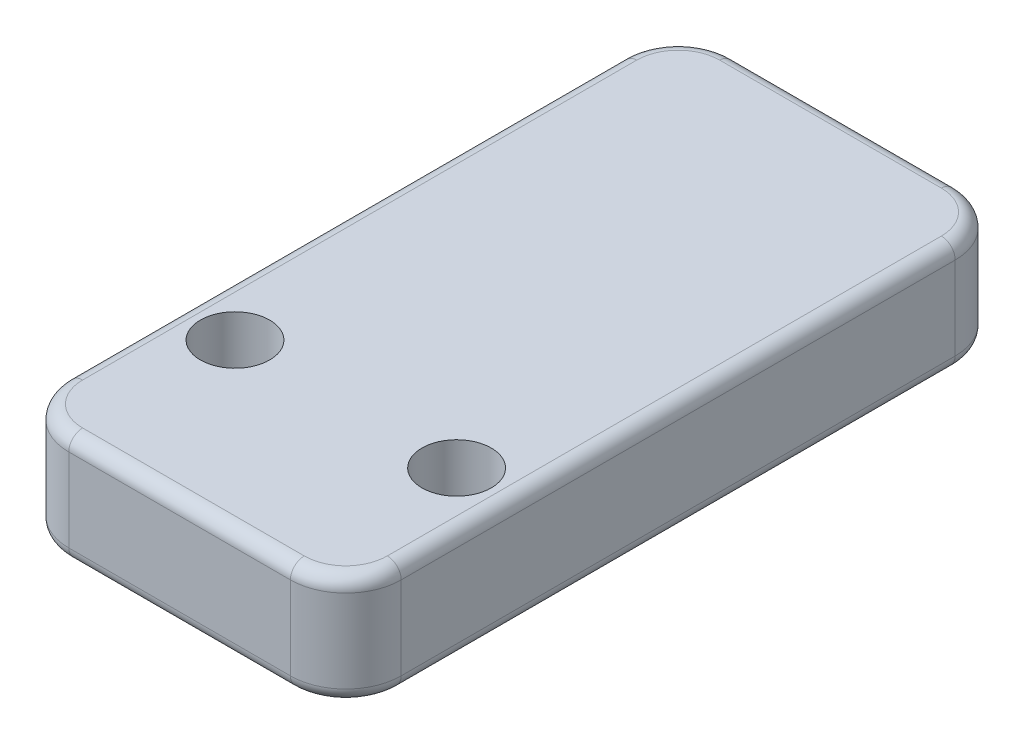
ISO-10303-21;
HEADER;
FILE_DESCRIPTION(('STEP AP214'),'2;1');
FILE_NAME('part.step','',(''),(''),'','','');
FILE_SCHEMA(('AUTOMOTIVE_DESIGN { 1 0 10303 214 1 1 1 1 }'));
ENDSEC;
DATA;
#1=APPLICATION_CONTEXT('core data for automotive mechanical design processes');
#2=APPLICATION_PROTOCOL_DEFINITION('international standard','automotive_design',2000,#1);
#3=PRODUCT_CONTEXT('',#1,'mechanical');
#4=PRODUCT('Part','Part','',(#3));
#5=PRODUCT_RELATED_PRODUCT_CATEGORY('part','',(#4));
#6=PRODUCT_DEFINITION_FORMATION('','',#4);
#7=PRODUCT_DEFINITION_CONTEXT('part definition',#1,'design');
#8=PRODUCT_DEFINITION('design','',#6,#7);
#9=PRODUCT_DEFINITION_SHAPE('','',#8);
#10=(LENGTH_UNIT() NAMED_UNIT(*) SI_UNIT(.MILLI.,.METRE.));
#11=(NAMED_UNIT(*) PLANE_ANGLE_UNIT() SI_UNIT($,.RADIAN.));
#12=(NAMED_UNIT(*) SI_UNIT($,.STERADIAN.) SOLID_ANGLE_UNIT());
#13=UNCERTAINTY_MEASURE_WITH_UNIT(LENGTH_MEASURE(1.E-05),#10,'distance_accuracy_value','');
#14=(GEOMETRIC_REPRESENTATION_CONTEXT(3) GLOBAL_UNCERTAINTY_ASSIGNED_CONTEXT((#13)) GLOBAL_UNIT_ASSIGNED_CONTEXT((#10,
#11,#12)) REPRESENTATION_CONTEXT('',''));
#15=CARTESIAN_POINT('',(0.,0.,0.));
#16=DIRECTION('',(0.,0.,1.));
#17=DIRECTION('',(1.,0.,0.));
#18=AXIS2_PLACEMENT_3D('',#15,#16,#17);
#19=CARTESIAN_POINT('',(-12.,8.,24.));
#20=DIRECTION('',(0.,0.,-1.));
#21=DIRECTION('',(-1.,0.,0.));
#22=AXIS2_PLACEMENT_3D('',#19,#20,#21);
#23=PLANE('',#22);
#24=DIRECTION('',(0.,-1.,0.));
#25=VECTOR('',#24,1.);
#26=CARTESIAN_POINT('',(8.,8.,24.));
#27=LINE('',#26,#25);
#28=CARTESIAN_POINT('',(8.,1.,24.));
#29=VERTEX_POINT('',#28);
#30=CARTESIAN_POINT('',(8.,7.,24.));
#31=VERTEX_POINT('',#30);
#32=EDGE_CURVE('E348',#29,#31,#27,.F.);
#33=ORIENTED_EDGE('',*,*,#32,.T.);
#34=DIRECTION('',(1.,0.,0.));
#35=VECTOR('',#34,1.);
#36=CARTESIAN_POINT('',(-8.,7.,24.));
#37=LINE('',#36,#35);
#38=CARTESIAN_POINT('',(-8.,7.,24.));
#39=VERTEX_POINT('',#38);
#40=EDGE_CURVE('E11',#31,#39,#37,.F.);
#41=ORIENTED_EDGE('',*,*,#40,.T.);
#42=DIRECTION('',(0.,-1.,0.));
#43=VECTOR('',#42,1.);
#44=CARTESIAN_POINT('',(-8.,0.,24.));
#45=LINE('',#44,#43);
#46=CARTESIAN_POINT('',(-8.,1.,24.));
#47=VERTEX_POINT('',#46);
#48=EDGE_CURVE('E355',#39,#47,#45,.T.);
#49=ORIENTED_EDGE('',*,*,#48,.T.);
#50=DIRECTION('',(1.,0.,0.));
#51=VECTOR('',#50,1.);
#52=CARTESIAN_POINT('',(-12.,1.,24.));
#53=LINE('',#52,#51);
#54=EDGE_CURVE('E55',#47,#29,#53,.T.);
#55=ORIENTED_EDGE('',*,*,#54,.T.);
#56=EDGE_LOOP('',(#33,#41,#49,#55));
#57=FACE_BOUND('',#56,.T.);
#58=ADVANCED_FACE('F45',(#57),#23,.F.);
#59=CARTESIAN_POINT('',(12.,8.,24.));
#60=DIRECTION('',(-1.,0.,0.));
#61=DIRECTION('',(0.,0.,1.));
#62=AXIS2_PLACEMENT_3D('',#59,#60,#61);
#63=PLANE('',#62);
#64=DIRECTION('',(0.,-1.,0.));
#65=VECTOR('',#64,1.);
#66=CARTESIAN_POINT('',(12.,8.,-20.));
#67=LINE('',#66,#65);
#68=CARTESIAN_POINT('',(12.,1.,-20.));
#69=VERTEX_POINT('',#68);
#70=CARTESIAN_POINT('',(12.,7.,-20.));
#71=VERTEX_POINT('',#70);
#72=EDGE_CURVE('E194',#69,#71,#67,.F.);
#73=ORIENTED_EDGE('',*,*,#72,.T.);
#74=DIRECTION('',(0.,0.,-1.));
#75=VECTOR('',#74,1.);
#76=CARTESIAN_POINT('',(12.,7.,20.));
#77=LINE('',#76,#75);
#78=CARTESIAN_POINT('',(12.,7.,20.));
#79=VERTEX_POINT('',#78);
#80=EDGE_CURVE('E276',#71,#79,#77,.F.);
#81=ORIENTED_EDGE('',*,*,#80,.T.);
#82=DIRECTION('',(0.,-1.,0.));
#83=VECTOR('',#82,1.);
#84=CARTESIAN_POINT('',(12.,8.,20.));
#85=LINE('',#84,#83);
#86=CARTESIAN_POINT('',(12.,1.,20.));
#87=VERTEX_POINT('',#86);
#88=EDGE_CURVE('E190',#79,#87,#85,.T.);
#89=ORIENTED_EDGE('',*,*,#88,.T.);
#90=DIRECTION('',(0.,0.,-1.));
#91=VECTOR('',#90,1.);
#92=CARTESIAN_POINT('',(12.,1.,24.));
#93=LINE('',#92,#91);
#94=EDGE_CURVE('E273',#87,#69,#93,.T.);
#95=ORIENTED_EDGE('',*,*,#94,.T.);
#96=EDGE_LOOP('',(#73,#81,#89,#95));
#97=FACE_BOUND('',#96,.T.);
#98=ADVANCED_FACE('F387',(#97),#63,.F.);
#99=CARTESIAN_POINT('',(-12.,8.,-24.));
#100=DIRECTION('',(0.,0.,-1.));
#101=DIRECTION('',(-1.,0.,0.));
#102=AXIS2_PLACEMENT_3D('',#99,#100,#101);
#103=PLANE('',#102);
#104=DIRECTION('',(0.,-1.,0.));
#105=VECTOR('',#104,1.);
#106=CARTESIAN_POINT('',(8.,0.,-24.));
#107=LINE('',#106,#105);
#108=CARTESIAN_POINT('',(8.,7.,-24.));
#109=VERTEX_POINT('',#108);
#110=CARTESIAN_POINT('',(8.,1.,-24.));
#111=VERTEX_POINT('',#110);
#112=EDGE_CURVE('E376',#109,#111,#107,.T.);
#113=ORIENTED_EDGE('',*,*,#112,.T.);
#114=DIRECTION('',(1.,0.,0.));
#115=VECTOR('',#114,1.);
#116=CARTESIAN_POINT('',(-8.,1.,-24.));
#117=LINE('',#116,#115);
#118=CARTESIAN_POINT('',(-8.,1.,-24.));
#119=VERTEX_POINT('',#118);
#120=EDGE_CURVE('E229',#111,#119,#117,.F.);
#121=ORIENTED_EDGE('',*,*,#120,.T.);
#122=DIRECTION('',(0.,-1.,0.));
#123=VECTOR('',#122,1.);
#124=CARTESIAN_POINT('',(-8.,8.,-24.));
#125=LINE('',#124,#123);
#126=CARTESIAN_POINT('',(-8.,7.,-24.));
#127=VERTEX_POINT('',#126);
#128=EDGE_CURVE('E380',#119,#127,#125,.F.);
#129=ORIENTED_EDGE('',*,*,#128,.T.);
#130=DIRECTION('',(1.,0.,0.));
#131=VECTOR('',#130,1.);
#132=CARTESIAN_POINT('',(-12.,7.,-24.));
#133=LINE('',#132,#131);
#134=EDGE_CURVE('E226',#127,#109,#133,.T.);
#135=ORIENTED_EDGE('',*,*,#134,.T.);
#136=EDGE_LOOP('',(#113,#121,#129,#135));
#137=FACE_BOUND('',#136,.T.);
#138=ADVANCED_FACE('F432',(#137),#103,.T.);
#139=CARTESIAN_POINT('',(-12.,8.,24.));
#140=DIRECTION('',(-1.,0.,0.));
#141=DIRECTION('',(0.,0.,1.));
#142=AXIS2_PLACEMENT_3D('',#139,#140,#141);
#143=PLANE('',#142);
#144=DIRECTION('',(0.,-1.,0.));
#145=VECTOR('',#144,1.);
#146=CARTESIAN_POINT('',(-12.,8.,-20.));
#147=LINE('',#146,#145);
#148=CARTESIAN_POINT('',(-12.,7.,-20.));
#149=VERTEX_POINT('',#148);
#150=CARTESIAN_POINT('',(-12.,1.,-20.));
#151=VERTEX_POINT('',#150);
#152=EDGE_CURVE('E360',#149,#151,#147,.T.);
#153=ORIENTED_EDGE('',*,*,#152,.T.);
#154=DIRECTION('',(0.,0.,-1.));
#155=VECTOR('',#154,1.);
#156=CARTESIAN_POINT('',(-12.,1.,20.));
#157=LINE('',#156,#155);
#158=CARTESIAN_POINT('',(-12.,1.,20.));
#159=VERTEX_POINT('',#158);
#160=EDGE_CURVE('E242',#151,#159,#157,.F.);
#161=ORIENTED_EDGE('',*,*,#160,.T.);
#162=DIRECTION('',(0.,-1.,0.));
#163=VECTOR('',#162,1.);
#164=CARTESIAN_POINT('',(-12.,8.,20.));
#165=LINE('',#164,#163);
#166=CARTESIAN_POINT('',(-12.,7.,20.));
#167=VERTEX_POINT('',#166);
#168=EDGE_CURVE('E372',#159,#167,#165,.F.);
#169=ORIENTED_EDGE('',*,*,#168,.T.);
#170=DIRECTION('',(0.,0.,-1.));
#171=VECTOR('',#170,1.);
#172=CARTESIAN_POINT('',(-12.,7.,24.));
#173=LINE('',#172,#171);
#174=EDGE_CURVE('E239',#167,#149,#173,.T.);
#175=ORIENTED_EDGE('',*,*,#174,.T.);
#176=EDGE_LOOP('',(#153,#161,#169,#175));
#177=FACE_BOUND('',#176,.T.);
#178=ADVANCED_FACE('F416',(#177),#143,.T.);
#179=CARTESIAN_POINT('',(0.,8.,0.));
#180=DIRECTION('',(0.,1.,0.));
#181=DIRECTION('',(0.,0.,1.));
#182=AXIS2_PLACEMENT_3D('',#179,#180,#181);
#183=PLANE('',#182);
#184=DIRECTION('',(1.,0.,0.));
#185=VECTOR('',#184,1.);
#186=CARTESIAN_POINT('',(0.,8.,-23.));
#187=LINE('',#186,#185);
#188=CARTESIAN_POINT('',(8.,8.,-23.));
#189=VERTEX_POINT('',#188);
#190=CARTESIAN_POINT('',(-8.,8.,-23.));
#191=VERTEX_POINT('',#190);
#192=EDGE_CURVE('E63',#189,#191,#187,.F.);
#193=ORIENTED_EDGE('',*,*,#192,.T.);
#194=CARTESIAN_POINT('',(-8.,8.,-20.));
#195=DIRECTION('',(0.,1.,0.));
#196=DIRECTION('',(0.,0.,1.));
#197=AXIS2_PLACEMENT_3D('',#194,#195,#196);
#198=CIRCLE('',#197,3.);
#199=CARTESIAN_POINT('',(-11.,8.,-20.));
#200=VERTEX_POINT('',#199);
#201=EDGE_CURVE('E270',#191,#200,#198,.T.);
#202=ORIENTED_EDGE('',*,*,#201,.T.);
#203=DIRECTION('',(0.,0.,-1.));
#204=VECTOR('',#203,1.);
#205=CARTESIAN_POINT('',(-11.,8.,0.));
#206=LINE('',#205,#204);
#207=CARTESIAN_POINT('',(-11.,8.,20.));
#208=VERTEX_POINT('',#207);
#209=EDGE_CURVE('E251',#200,#208,#206,.F.);
#210=ORIENTED_EDGE('',*,*,#209,.T.);
#211=CARTESIAN_POINT('',(-8.,8.,20.));
#212=DIRECTION('',(0.,1.,0.));
#213=DIRECTION('',(0.,0.,1.));
#214=AXIS2_PLACEMENT_3D('',#211,#212,#213);
#215=CIRCLE('',#214,3.);
#216=CARTESIAN_POINT('',(-8.,8.,23.));
#217=VERTEX_POINT('',#216);
#218=EDGE_CURVE('E254',#208,#217,#215,.T.);
#219=ORIENTED_EDGE('',*,*,#218,.T.);
#220=DIRECTION('',(1.,0.,0.));
#221=VECTOR('',#220,1.);
#222=CARTESIAN_POINT('',(8.,8.,23.));
#223=LINE('',#222,#221);
#224=CARTESIAN_POINT('',(8.,8.,23.));
#225=VERTEX_POINT('',#224);
#226=EDGE_CURVE('E257',#217,#225,#223,.T.);
#227=ORIENTED_EDGE('',*,*,#226,.T.);
#228=CARTESIAN_POINT('',(8.,8.,20.));
#229=DIRECTION('',(0.,1.,0.));
#230=DIRECTION('',(0.,0.,1.));
#231=AXIS2_PLACEMENT_3D('',#228,#229,#230);
#232=CIRCLE('',#231,3.);
#233=CARTESIAN_POINT('',(11.,8.,20.));
#234=VERTEX_POINT('',#233);
#235=EDGE_CURVE('E260',#225,#234,#232,.T.);
#236=ORIENTED_EDGE('',*,*,#235,.T.);
#237=DIRECTION('',(0.,0.,-1.));
#238=VECTOR('',#237,1.);
#239=CARTESIAN_POINT('',(11.,8.,-20.));
#240=LINE('',#239,#238);
#241=CARTESIAN_POINT('',(11.,8.,-20.));
#242=VERTEX_POINT('',#241);
#243=EDGE_CURVE('E263',#234,#242,#240,.T.);
#244=ORIENTED_EDGE('',*,*,#243,.T.);
#245=CARTESIAN_POINT('',(8.,8.,-20.));
#246=DIRECTION('',(0.,1.,0.));
#247=DIRECTION('',(0.,0.,1.));
#248=AXIS2_PLACEMENT_3D('',#245,#246,#247);
#249=CIRCLE('',#248,3.);
#250=EDGE_CURVE('E68',#242,#189,#249,.T.);
#251=ORIENTED_EDGE('',*,*,#250,.T.);
#252=EDGE_LOOP('',(#193,#202,#210,#219,#227,#236,#244,#251));
#253=FACE_BOUND('',#252,.T.);
#254=CARTESIAN_POINT('',(8.,8.,12.));
#255=DIRECTION('',(0.,1.,0.));
#256=DIRECTION('',(0.,0.,1.));
#257=AXIS2_PLACEMENT_3D('',#254,#255,#256);
#258=CIRCLE('',#257,2.5);
#259=CARTESIAN_POINT('',(8.,8.,14.5));
#260=VERTEX_POINT('',#259);
#261=EDGE_CURVE('E363',#260,#260,#258,.T.);
#262=ORIENTED_EDGE('',*,*,#261,.F.);
#263=EDGE_LOOP('',(#262));
#264=FACE_BOUND('',#263,.T.);
#265=CARTESIAN_POINT('',(-8.,8.,12.));
#266=DIRECTION('',(0.,1.,0.));
#267=DIRECTION('',(0.,0.,1.));
#268=AXIS2_PLACEMENT_3D('',#265,#266,#267);
#269=CIRCLE('',#268,2.5);
#270=CARTESIAN_POINT('',(-8.,8.,14.5));
#271=VERTEX_POINT('',#270);
#272=EDGE_CURVE('E366',#271,#271,#269,.T.);
#273=ORIENTED_EDGE('',*,*,#272,.F.);
#274=EDGE_LOOP('',(#273));
#275=FACE_BOUND('',#274,.T.);
#276=ADVANCED_FACE('F403',(#253,#264,#275),#183,.T.);
#277=CARTESIAN_POINT('',(0.,0.,0.));
#278=DIRECTION('',(0.,1.,0.));
#279=DIRECTION('',(0.,0.,1.));
#280=AXIS2_PLACEMENT_3D('',#277,#278,#279);
#281=PLANE('',#280);
#282=CARTESIAN_POINT('',(-8.,0.,-20.));
#283=DIRECTION('',(0.,1.,0.));
#284=DIRECTION('',(0.,0.,1.));
#285=AXIS2_PLACEMENT_3D('',#282,#283,#284);
#286=CIRCLE('',#285,3.);
#287=CARTESIAN_POINT('',(-11.,0.,-20.));
#288=VERTEX_POINT('',#287);
#289=CARTESIAN_POINT('',(-8.,0.,-23.));
#290=VERTEX_POINT('',#289);
#291=EDGE_CURVE('E209',#288,#290,#286,.F.);
#292=ORIENTED_EDGE('',*,*,#291,.T.);
#293=DIRECTION('',(1.,0.,0.));
#294=VECTOR('',#293,1.);
#295=CARTESIAN_POINT('',(8.,0.,-23.));
#296=LINE('',#295,#294);
#297=CARTESIAN_POINT('',(8.,0.,-23.));
#298=VERTEX_POINT('',#297);
#299=EDGE_CURVE('E168',#290,#298,#296,.T.);
#300=ORIENTED_EDGE('',*,*,#299,.T.);
#301=CARTESIAN_POINT('',(8.,0.,-20.));
#302=DIRECTION('',(0.,1.,0.));
#303=DIRECTION('',(0.,0.,1.));
#304=AXIS2_PLACEMENT_3D('',#301,#302,#303);
#305=CIRCLE('',#304,3.);
#306=CARTESIAN_POINT('',(11.,0.,-20.));
#307=VERTEX_POINT('',#306);
#308=EDGE_CURVE('E159',#298,#307,#305,.F.);
#309=ORIENTED_EDGE('',*,*,#308,.T.);
#310=DIRECTION('',(0.,0.,-1.));
#311=VECTOR('',#310,1.);
#312=CARTESIAN_POINT('',(11.,0.,0.));
#313=LINE('',#312,#311);
#314=CARTESIAN_POINT('',(11.,0.,20.));
#315=VERTEX_POINT('',#314);
#316=EDGE_CURVE('E165',#307,#315,#313,.F.);
#317=ORIENTED_EDGE('',*,*,#316,.T.);
#318=CARTESIAN_POINT('',(8.,0.,20.));
#319=DIRECTION('',(0.,1.,0.));
#320=DIRECTION('',(0.,0.,1.));
#321=AXIS2_PLACEMENT_3D('',#318,#319,#320);
#322=CIRCLE('',#321,3.);
#323=CARTESIAN_POINT('',(8.,0.,23.));
#324=VERTEX_POINT('',#323);
#325=EDGE_CURVE('E173',#315,#324,#322,.F.);
#326=ORIENTED_EDGE('',*,*,#325,.T.);
#327=DIRECTION('',(1.,0.,0.));
#328=VECTOR('',#327,1.);
#329=CARTESIAN_POINT('',(0.,0.,23.));
#330=LINE('',#329,#328);
#331=CARTESIAN_POINT('',(-8.,0.,23.));
#332=VERTEX_POINT('',#331);
#333=EDGE_CURVE('E200',#324,#332,#330,.F.);
#334=ORIENTED_EDGE('',*,*,#333,.T.);
#335=CARTESIAN_POINT('',(-8.,0.,20.));
#336=DIRECTION('',(0.,1.,0.));
#337=DIRECTION('',(0.,0.,1.));
#338=AXIS2_PLACEMENT_3D('',#335,#336,#337);
#339=CIRCLE('',#338,3.);
#340=CARTESIAN_POINT('',(-11.,0.,20.));
#341=VERTEX_POINT('',#340);
#342=EDGE_CURVE('E203',#332,#341,#339,.F.);
#343=ORIENTED_EDGE('',*,*,#342,.T.);
#344=DIRECTION('',(0.,0.,-1.));
#345=VECTOR('',#344,1.);
#346=CARTESIAN_POINT('',(-11.,0.,-20.));
#347=LINE('',#346,#345);
#348=EDGE_CURVE('E206',#341,#288,#347,.T.);
#349=ORIENTED_EDGE('',*,*,#348,.T.);
#350=EDGE_LOOP('',(#292,#300,#309,#317,#326,#334,#343,#349));
#351=FACE_BOUND('',#350,.T.);
#352=CARTESIAN_POINT('',(8.,0.,12.));
#353=DIRECTION('',(0.,1.,0.));
#354=DIRECTION('',(0.,0.,1.));
#355=AXIS2_PLACEMENT_3D('',#352,#353,#354);
#356=CIRCLE('',#355,2.5);
#357=CARTESIAN_POINT('',(8.,0.,14.5));
#358=VERTEX_POINT('',#357);
#359=EDGE_CURVE('E356',#358,#358,#356,.F.);
#360=ORIENTED_EDGE('',*,*,#359,.F.);
#361=EDGE_LOOP('',(#360));
#362=FACE_BOUND('',#361,.T.);
#363=CARTESIAN_POINT('',(-8.,0.,12.));
#364=DIRECTION('',(0.,1.,0.));
#365=DIRECTION('',(0.,0.,1.));
#366=AXIS2_PLACEMENT_3D('',#363,#364,#365);
#367=CIRCLE('',#366,2.5);
#368=CARTESIAN_POINT('',(-8.,0.,14.5));
#369=VERTEX_POINT('',#368);
#370=EDGE_CURVE('E303',#369,#369,#367,.F.);
#371=ORIENTED_EDGE('',*,*,#370,.F.);
#372=EDGE_LOOP('',(#371));
#373=FACE_BOUND('',#372,.T.);
#374=ADVANCED_FACE('F161',(#351,#362,#373),#281,.F.);
#375=CARTESIAN_POINT('',(-8.,8.,20.));
#376=DIRECTION('',(0.,1.,0.));
#377=DIRECTION('',(0.,0.,1.));
#378=AXIS2_PLACEMENT_3D('',#375,#376,#377);
#379=CYLINDRICAL_SURFACE('',#378,4.);
#380=ORIENTED_EDGE('',*,*,#168,.F.);
#381=CARTESIAN_POINT('',(-8.,1.,20.));
#382=DIRECTION('',(0.,1.,0.));
#383=DIRECTION('',(0.,0.,1.));
#384=AXIS2_PLACEMENT_3D('',#381,#382,#383);
#385=CIRCLE('',#384,4.);
#386=EDGE_CURVE('E248',#159,#47,#385,.T.);
#387=ORIENTED_EDGE('',*,*,#386,.T.);
#388=ORIENTED_EDGE('',*,*,#48,.F.);
#389=CARTESIAN_POINT('',(-8.,7.,20.));
#390=DIRECTION('',(0.,1.,0.));
#391=DIRECTION('',(0.,0.,1.));
#392=AXIS2_PLACEMENT_3D('',#389,#390,#391);
#393=CIRCLE('',#392,4.);
#394=EDGE_CURVE('E245',#39,#167,#393,.F.);
#395=ORIENTED_EDGE('',*,*,#394,.T.);
#396=EDGE_LOOP('',(#380,#387,#388,#395));
#397=FACE_BOUND('',#396,.T.);
#398=ADVANCED_FACE('F447',(#397),#379,.T.);
#399=CARTESIAN_POINT('',(-8.,8.,-20.));
#400=DIRECTION('',(0.,-1.,0.));
#401=DIRECTION('',(0.,0.,-1.));
#402=AXIS2_PLACEMENT_3D('',#399,#400,#401);
#403=CYLINDRICAL_SURFACE('',#402,4.);
#404=ORIENTED_EDGE('',*,*,#128,.F.);
#405=CARTESIAN_POINT('',(-8.,1.,-20.));
#406=DIRECTION('',(0.,1.,0.));
#407=DIRECTION('',(0.,0.,1.));
#408=AXIS2_PLACEMENT_3D('',#405,#406,#407);
#409=CIRCLE('',#408,4.);
#410=EDGE_CURVE('E236',#119,#151,#409,.T.);
#411=ORIENTED_EDGE('',*,*,#410,.T.);
#412=ORIENTED_EDGE('',*,*,#152,.F.);
#413=CARTESIAN_POINT('',(-8.,7.,-20.));
#414=DIRECTION('',(0.,1.,0.));
#415=DIRECTION('',(0.,0.,1.));
#416=AXIS2_PLACEMENT_3D('',#413,#414,#415);
#417=CIRCLE('',#416,4.);
#418=EDGE_CURVE('E232',#149,#127,#417,.F.);
#419=ORIENTED_EDGE('',*,*,#418,.T.);
#420=EDGE_LOOP('',(#404,#411,#412,#419));
#421=FACE_BOUND('',#420,.T.);
#422=ADVANCED_FACE('F421',(#421),#403,.T.);
#423=CARTESIAN_POINT('',(8.,8.,20.));
#424=DIRECTION('',(0.,-1.,0.));
#425=DIRECTION('',(0.,0.,-1.));
#426=AXIS2_PLACEMENT_3D('',#423,#424,#425);
#427=CYLINDRICAL_SURFACE('',#426,4.);
#428=ORIENTED_EDGE('',*,*,#32,.F.);
#429=CARTESIAN_POINT('',(8.,1.,20.));
#430=DIRECTION('',(0.,1.,0.));
#431=DIRECTION('',(0.,0.,1.));
#432=AXIS2_PLACEMENT_3D('',#429,#430,#431);
#433=CIRCLE('',#432,4.);
#434=EDGE_CURVE('E217',#29,#87,#433,.T.);
#435=ORIENTED_EDGE('',*,*,#434,.T.);
#436=ORIENTED_EDGE('',*,*,#88,.F.);
#437=CARTESIAN_POINT('',(8.,7.,20.));
#438=DIRECTION('',(0.,1.,0.));
#439=DIRECTION('',(0.,0.,1.));
#440=AXIS2_PLACEMENT_3D('',#437,#438,#439);
#441=CIRCLE('',#440,4.);
#442=EDGE_CURVE('E214',#79,#31,#441,.F.);
#443=ORIENTED_EDGE('',*,*,#442,.T.);
#444=EDGE_LOOP('',(#428,#435,#436,#443));
#445=FACE_BOUND('',#444,.T.);
#446=ADVANCED_FACE('F347',(#445),#427,.T.);
#447=CARTESIAN_POINT('',(8.,8.,-20.));
#448=DIRECTION('',(0.,1.,0.));
#449=DIRECTION('',(0.,0.,1.));
#450=AXIS2_PLACEMENT_3D('',#447,#448,#449);
#451=CYLINDRICAL_SURFACE('',#450,4.);
#452=ORIENTED_EDGE('',*,*,#72,.F.);
#453=CARTESIAN_POINT('',(8.,1.,-20.));
#454=DIRECTION('',(0.,1.,0.));
#455=DIRECTION('',(0.,0.,1.));
#456=AXIS2_PLACEMENT_3D('',#453,#454,#455);
#457=CIRCLE('',#456,4.);
#458=EDGE_CURVE('E179',#69,#111,#457,.T.);
#459=ORIENTED_EDGE('',*,*,#458,.T.);
#460=ORIENTED_EDGE('',*,*,#112,.F.);
#461=CARTESIAN_POINT('',(8.,7.,-20.));
#462=DIRECTION('',(0.,1.,0.));
#463=DIRECTION('',(0.,0.,1.));
#464=AXIS2_PLACEMENT_3D('',#461,#462,#463);
#465=CIRCLE('',#464,4.);
#466=EDGE_CURVE('E221',#109,#71,#465,.F.);
#467=ORIENTED_EDGE('',*,*,#466,.T.);
#468=EDGE_LOOP('',(#452,#459,#460,#467));
#469=FACE_BOUND('',#468,.T.);
#470=ADVANCED_FACE('F389',(#469),#451,.T.);
#471=CARTESIAN_POINT('',(-8.,-7.07106781186548,12.));
#472=DIRECTION('',(0.,1.,0.));
#473=DIRECTION('',(0.,0.,1.));
#474=AXIS2_PLACEMENT_3D('',#471,#472,#473);
#475=CYLINDRICAL_SURFACE('',#474,2.5);
#476=ORIENTED_EDGE('',*,*,#370,.T.);
#477=EDGE_LOOP('',(#476));
#478=FACE_BOUND('',#477,.T.);
#479=ORIENTED_EDGE('',*,*,#272,.T.);
#480=EDGE_LOOP('',(#479));
#481=FACE_BOUND('',#480,.T.);
#482=ADVANCED_FACE('F457',(#478,#481),#475,.F.);
#483=CARTESIAN_POINT('',(8.,-7.07106781186548,12.));
#484=DIRECTION('',(0.,1.,0.));
#485=DIRECTION('',(0.,0.,1.));
#486=AXIS2_PLACEMENT_3D('',#483,#484,#485);
#487=CYLINDRICAL_SURFACE('',#486,2.5);
#488=ORIENTED_EDGE('',*,*,#359,.T.);
#489=EDGE_LOOP('',(#488));
#490=FACE_BOUND('',#489,.T.);
#491=ORIENTED_EDGE('',*,*,#261,.T.);
#492=EDGE_LOOP('',(#491));
#493=FACE_BOUND('',#492,.T.);
#494=ADVANCED_FACE('F482',(#490,#493),#487,.F.);
#495=CARTESIAN_POINT('',(-8.,1.,-20.));
#496=DIRECTION('',(0.,1.,0.));
#497=DIRECTION('',(0.,0.,1.));
#498=AXIS2_PLACEMENT_3D('',#495,#496,#497);
#499=TOROIDAL_SURFACE('',#498,3.,1.);
#500=CARTESIAN_POINT('',(-11.,1.,-20.));
#501=DIRECTION('',(0.,0.,1.));
#502=DIRECTION('',(1.,0.,0.));
#503=AXIS2_PLACEMENT_3D('',#500,#501,#502);
#504=CIRCLE('',#503,1.);
#505=EDGE_CURVE('E295',#151,#288,#504,.T.);
#506=ORIENTED_EDGE('',*,*,#505,.F.);
#507=ORIENTED_EDGE('',*,*,#410,.F.);
#508=CARTESIAN_POINT('',(-8.,1.,-23.));
#509=DIRECTION('',(1.,0.,0.));
#510=DIRECTION('',(0.,0.,-1.));
#511=AXIS2_PLACEMENT_3D('',#508,#509,#510);
#512=CIRCLE('',#511,1.);
#513=EDGE_CURVE('E299',#290,#119,#512,.T.);
#514=ORIENTED_EDGE('',*,*,#513,.F.);
#515=ORIENTED_EDGE('',*,*,#291,.F.);
#516=EDGE_LOOP('',(#506,#507,#514,#515));
#517=FACE_BOUND('',#516,.T.);
#518=ADVANCED_FACE('F425',(#517),#499,.T.);
#519=CARTESIAN_POINT('',(0.,1.,-23.));
#520=DIRECTION('',(-1.,0.,0.));
#521=DIRECTION('',(0.,0.,1.));
#522=AXIS2_PLACEMENT_3D('',#519,#520,#521);
#523=CYLINDRICAL_SURFACE('',#522,1.);
#524=ORIENTED_EDGE('',*,*,#513,.T.);
#525=ORIENTED_EDGE('',*,*,#120,.F.);
#526=CARTESIAN_POINT('',(8.,1.,-23.));
#527=DIRECTION('',(1.,0.,0.));
#528=DIRECTION('',(0.,0.,-1.));
#529=AXIS2_PLACEMENT_3D('',#526,#527,#528);
#530=CIRCLE('',#529,1.);
#531=EDGE_CURVE('E292',#298,#111,#530,.T.);
#532=ORIENTED_EDGE('',*,*,#531,.F.);
#533=ORIENTED_EDGE('',*,*,#299,.F.);
#534=EDGE_LOOP('',(#524,#525,#532,#533));
#535=FACE_BOUND('',#534,.T.);
#536=ADVANCED_FACE('F430',(#535),#523,.T.);
#537=CARTESIAN_POINT('',(-11.,1.,0.));
#538=DIRECTION('',(0.,0.,1.));
#539=DIRECTION('',(1.,0.,0.));
#540=AXIS2_PLACEMENT_3D('',#537,#538,#539);
#541=CYLINDRICAL_SURFACE('',#540,1.);
#542=ORIENTED_EDGE('',*,*,#505,.T.);
#543=ORIENTED_EDGE('',*,*,#348,.F.);
#544=CARTESIAN_POINT('',(-11.,1.,20.));
#545=DIRECTION('',(0.,0.,1.));
#546=DIRECTION('',(1.,0.,0.));
#547=AXIS2_PLACEMENT_3D('',#544,#545,#546);
#548=CIRCLE('',#547,1.);
#549=EDGE_CURVE('E183',#159,#341,#548,.T.);
#550=ORIENTED_EDGE('',*,*,#549,.F.);
#551=ORIENTED_EDGE('',*,*,#160,.F.);
#552=EDGE_LOOP('',(#542,#543,#550,#551));
#553=FACE_BOUND('',#552,.T.);
#554=ADVANCED_FACE('F474',(#553),#541,.T.);
#555=CARTESIAN_POINT('',(8.,1.,-20.));
#556=DIRECTION('',(0.,1.,0.));
#557=DIRECTION('',(0.,0.,1.));
#558=AXIS2_PLACEMENT_3D('',#555,#556,#557);
#559=TOROIDAL_SURFACE('',#558,3.,1.);
#560=ORIENTED_EDGE('',*,*,#531,.T.);
#561=ORIENTED_EDGE('',*,*,#458,.F.);
#562=CARTESIAN_POINT('',(11.,1.,-20.));
#563=DIRECTION('',(0.,0.,1.));
#564=DIRECTION('',(1.,0.,0.));
#565=AXIS2_PLACEMENT_3D('',#562,#563,#564);
#566=CIRCLE('',#565,1.);
#567=EDGE_CURVE('E177',#307,#69,#566,.T.);
#568=ORIENTED_EDGE('',*,*,#567,.F.);
#569=ORIENTED_EDGE('',*,*,#308,.F.);
#570=EDGE_LOOP('',(#560,#561,#568,#569));
#571=FACE_BOUND('',#570,.T.);
#572=ADVANCED_FACE('F178',(#571),#559,.T.);
#573=CARTESIAN_POINT('',(-8.,1.,20.));
#574=DIRECTION('',(0.,1.,0.));
#575=DIRECTION('',(0.,0.,1.));
#576=AXIS2_PLACEMENT_3D('',#573,#574,#575);
#577=TOROIDAL_SURFACE('',#576,3.,1.);
#578=ORIENTED_EDGE('',*,*,#549,.T.);
#579=ORIENTED_EDGE('',*,*,#342,.F.);
#580=CARTESIAN_POINT('',(-8.,1.,23.));
#581=DIRECTION('',(1.,0.,0.));
#582=DIRECTION('',(0.,0.,-1.));
#583=AXIS2_PLACEMENT_3D('',#580,#581,#582);
#584=CIRCLE('',#583,1.);
#585=EDGE_CURVE('E184',#47,#332,#584,.T.);
#586=ORIENTED_EDGE('',*,*,#585,.F.);
#587=ORIENTED_EDGE('',*,*,#386,.F.);
#588=EDGE_LOOP('',(#578,#579,#586,#587));
#589=FACE_BOUND('',#588,.T.);
#590=ADVANCED_FACE('F468',(#589),#577,.T.);
#591=CARTESIAN_POINT('',(11.,1.,24.));
#592=DIRECTION('',(0.,0.,-1.));
#593=DIRECTION('',(-1.,0.,0.));
#594=AXIS2_PLACEMENT_3D('',#591,#592,#593);
#595=CYLINDRICAL_SURFACE('',#594,1.);
#596=ORIENTED_EDGE('',*,*,#567,.T.);
#597=ORIENTED_EDGE('',*,*,#94,.F.);
#598=CARTESIAN_POINT('',(11.,1.,20.));
#599=DIRECTION('',(0.,0.,1.));
#600=DIRECTION('',(1.,0.,0.));
#601=AXIS2_PLACEMENT_3D('',#598,#599,#600);
#602=CIRCLE('',#601,1.);
#603=EDGE_CURVE('E187',#315,#87,#602,.T.);
#604=ORIENTED_EDGE('',*,*,#603,.F.);
#605=ORIENTED_EDGE('',*,*,#316,.F.);
#606=EDGE_LOOP('',(#596,#597,#604,#605));
#607=FACE_BOUND('',#606,.T.);
#608=ADVANCED_FACE('F186',(#607),#595,.T.);
#609=CARTESIAN_POINT('',(-12.,1.,23.));
#610=DIRECTION('',(1.,0.,0.));
#611=DIRECTION('',(0.,0.,-1.));
#612=AXIS2_PLACEMENT_3D('',#609,#610,#611);
#613=CYLINDRICAL_SURFACE('',#612,1.);
#614=ORIENTED_EDGE('',*,*,#585,.T.);
#615=ORIENTED_EDGE('',*,*,#333,.F.);
#616=CARTESIAN_POINT('',(8.,1.,23.));
#617=DIRECTION('',(1.,0.,0.));
#618=DIRECTION('',(0.,0.,-1.));
#619=AXIS2_PLACEMENT_3D('',#616,#617,#618);
#620=CIRCLE('',#619,1.);
#621=EDGE_CURVE('E281',#29,#324,#620,.T.);
#622=ORIENTED_EDGE('',*,*,#621,.F.);
#623=ORIENTED_EDGE('',*,*,#54,.F.);
#624=EDGE_LOOP('',(#614,#615,#622,#623));
#625=FACE_BOUND('',#624,.T.);
#626=ADVANCED_FACE('F461',(#625),#613,.T.);
#627=CARTESIAN_POINT('',(8.,1.,20.));
#628=DIRECTION('',(0.,1.,0.));
#629=DIRECTION('',(0.,0.,1.));
#630=AXIS2_PLACEMENT_3D('',#627,#628,#629);
#631=TOROIDAL_SURFACE('',#630,3.,1.);
#632=ORIENTED_EDGE('',*,*,#603,.T.);
#633=ORIENTED_EDGE('',*,*,#434,.F.);
#634=ORIENTED_EDGE('',*,*,#621,.T.);
#635=ORIENTED_EDGE('',*,*,#325,.F.);
#636=EDGE_LOOP('',(#632,#633,#634,#635));
#637=FACE_BOUND('',#636,.T.);
#638=ADVANCED_FACE('F458',(#637),#631,.T.);
#639=CARTESIAN_POINT('',(8.,7.,20.));
#640=DIRECTION('',(0.,1.,0.));
#641=DIRECTION('',(0.,0.,1.));
#642=AXIS2_PLACEMENT_3D('',#639,#640,#641);
#643=TOROIDAL_SURFACE('',#642,3.,1.);
#644=CARTESIAN_POINT('',(8.,7.,23.));
#645=DIRECTION('',(-1.,0.,0.));
#646=DIRECTION('',(0.,0.,1.));
#647=AXIS2_PLACEMENT_3D('',#644,#645,#646);
#648=CIRCLE('',#647,1.);
#649=EDGE_CURVE('E325',#31,#225,#648,.T.);
#650=ORIENTED_EDGE('',*,*,#649,.F.);
#651=ORIENTED_EDGE('',*,*,#442,.F.);
#652=CARTESIAN_POINT('',(11.,7.,20.));
#653=DIRECTION('',(0.,0.,-1.));
#654=DIRECTION('',(-1.,0.,0.));
#655=AXIS2_PLACEMENT_3D('',#652,#653,#654);
#656=CIRCLE('',#655,1.);
#657=EDGE_CURVE('E49',#234,#79,#656,.T.);
#658=ORIENTED_EDGE('',*,*,#657,.F.);
#659=ORIENTED_EDGE('',*,*,#235,.F.);
#660=EDGE_LOOP('',(#650,#651,#658,#659));
#661=FACE_BOUND('',#660,.T.);
#662=ADVANCED_FACE('F47',(#661),#643,.T.);
#663=CARTESIAN_POINT('',(11.,7.,0.));
#664=DIRECTION('',(0.,0.,1.));
#665=DIRECTION('',(1.,0.,0.));
#666=AXIS2_PLACEMENT_3D('',#663,#664,#665);
#667=CYLINDRICAL_SURFACE('',#666,1.);
#668=ORIENTED_EDGE('',*,*,#657,.T.);
#669=ORIENTED_EDGE('',*,*,#80,.F.);
#670=CARTESIAN_POINT('',(11.,7.,-20.));
#671=DIRECTION('',(0.,0.,-1.));
#672=DIRECTION('',(-1.,0.,0.));
#673=AXIS2_PLACEMENT_3D('',#670,#671,#672);
#674=CIRCLE('',#673,1.);
#675=EDGE_CURVE('E322',#242,#71,#674,.T.);
#676=ORIENTED_EDGE('',*,*,#675,.F.);
#677=ORIENTED_EDGE('',*,*,#243,.F.);
#678=EDGE_LOOP('',(#668,#669,#676,#677));
#679=FACE_BOUND('',#678,.T.);
#680=ADVANCED_FACE('F338',(#679),#667,.T.);
#681=CARTESIAN_POINT('',(0.,7.,23.));
#682=DIRECTION('',(-1.,0.,0.));
#683=DIRECTION('',(0.,0.,1.));
#684=AXIS2_PLACEMENT_3D('',#681,#682,#683);
#685=CYLINDRICAL_SURFACE('',#684,1.);
#686=ORIENTED_EDGE('',*,*,#649,.T.);
#687=ORIENTED_EDGE('',*,*,#226,.F.);
#688=CARTESIAN_POINT('',(-8.,7.,23.));
#689=DIRECTION('',(-1.,0.,0.));
#690=DIRECTION('',(0.,0.,1.));
#691=AXIS2_PLACEMENT_3D('',#688,#689,#690);
#692=CIRCLE('',#691,1.);
#693=EDGE_CURVE('E318',#39,#217,#692,.T.);
#694=ORIENTED_EDGE('',*,*,#693,.F.);
#695=ORIENTED_EDGE('',*,*,#40,.F.);
#696=EDGE_LOOP('',(#686,#687,#694,#695));
#697=FACE_BOUND('',#696,.T.);
#698=ADVANCED_FACE('F493',(#697),#685,.T.);
#699=CARTESIAN_POINT('',(8.,7.,-20.));
#700=DIRECTION('',(0.,1.,0.));
#701=DIRECTION('',(0.,0.,1.));
#702=AXIS2_PLACEMENT_3D('',#699,#700,#701);
#703=TOROIDAL_SURFACE('',#702,3.,1.);
#704=ORIENTED_EDGE('',*,*,#675,.T.);
#705=ORIENTED_EDGE('',*,*,#466,.F.);
#706=CARTESIAN_POINT('',(8.,7.,-23.));
#707=DIRECTION('',(-1.,0.,0.));
#708=DIRECTION('',(0.,0.,1.));
#709=AXIS2_PLACEMENT_3D('',#706,#707,#708);
#710=CIRCLE('',#709,1.);
#711=EDGE_CURVE('E314',#189,#109,#710,.T.);
#712=ORIENTED_EDGE('',*,*,#711,.F.);
#713=ORIENTED_EDGE('',*,*,#250,.F.);
#714=EDGE_LOOP('',(#704,#705,#712,#713));
#715=FACE_BOUND('',#714,.T.);
#716=ADVANCED_FACE('F393',(#715),#703,.T.);
#717=CARTESIAN_POINT('',(-8.,7.,20.));
#718=DIRECTION('',(0.,1.,0.));
#719=DIRECTION('',(0.,0.,1.));
#720=AXIS2_PLACEMENT_3D('',#717,#718,#719);
#721=TOROIDAL_SURFACE('',#720,3.,1.);
#722=ORIENTED_EDGE('',*,*,#693,.T.);
#723=ORIENTED_EDGE('',*,*,#218,.F.);
#724=CARTESIAN_POINT('',(-11.,7.,20.));
#725=DIRECTION('',(0.,0.,-1.));
#726=DIRECTION('',(-1.,0.,0.));
#727=AXIS2_PLACEMENT_3D('',#724,#725,#726);
#728=CIRCLE('',#727,1.);
#729=EDGE_CURVE('E310',#167,#208,#728,.T.);
#730=ORIENTED_EDGE('',*,*,#729,.F.);
#731=ORIENTED_EDGE('',*,*,#394,.F.);
#732=EDGE_LOOP('',(#722,#723,#730,#731));
#733=FACE_BOUND('',#732,.T.);
#734=ADVANCED_FACE('F409',(#733),#721,.T.);
#735=CARTESIAN_POINT('',(-12.,7.,-23.));
#736=DIRECTION('',(1.,0.,0.));
#737=DIRECTION('',(0.,0.,-1.));
#738=AXIS2_PLACEMENT_3D('',#735,#736,#737);
#739=CYLINDRICAL_SURFACE('',#738,1.);
#740=ORIENTED_EDGE('',*,*,#711,.T.);
#741=ORIENTED_EDGE('',*,*,#134,.F.);
#742=CARTESIAN_POINT('',(-8.,7.,-23.));
#743=DIRECTION('',(-1.,0.,0.));
#744=DIRECTION('',(0.,0.,1.));
#745=AXIS2_PLACEMENT_3D('',#742,#743,#744);
#746=CIRCLE('',#745,1.);
#747=EDGE_CURVE('E307',#191,#127,#746,.T.);
#748=ORIENTED_EDGE('',*,*,#747,.F.);
#749=ORIENTED_EDGE('',*,*,#192,.F.);
#750=EDGE_LOOP('',(#740,#741,#748,#749));
#751=FACE_BOUND('',#750,.T.);
#752=ADVANCED_FACE('F396',(#751),#739,.T.);
#753=CARTESIAN_POINT('',(-11.,7.,24.));
#754=DIRECTION('',(0.,0.,-1.));
#755=DIRECTION('',(-1.,0.,0.));
#756=AXIS2_PLACEMENT_3D('',#753,#754,#755);
#757=CYLINDRICAL_SURFACE('',#756,1.);
#758=ORIENTED_EDGE('',*,*,#729,.T.);
#759=ORIENTED_EDGE('',*,*,#209,.F.);
#760=CARTESIAN_POINT('',(-11.,7.,-20.));
#761=DIRECTION('',(0.,0.,-1.));
#762=DIRECTION('',(-1.,0.,0.));
#763=AXIS2_PLACEMENT_3D('',#760,#761,#762);
#764=CIRCLE('',#763,1.);
#765=EDGE_CURVE('E304',#149,#200,#764,.T.);
#766=ORIENTED_EDGE('',*,*,#765,.F.);
#767=ORIENTED_EDGE('',*,*,#174,.F.);
#768=EDGE_LOOP('',(#758,#759,#766,#767));
#769=FACE_BOUND('',#768,.T.);
#770=ADVANCED_FACE('F413',(#769),#757,.T.);
#771=CARTESIAN_POINT('',(-8.,7.,-20.));
#772=DIRECTION('',(0.,1.,0.));
#773=DIRECTION('',(0.,0.,1.));
#774=AXIS2_PLACEMENT_3D('',#771,#772,#773);
#775=TOROIDAL_SURFACE('',#774,3.,1.);
#776=ORIENTED_EDGE('',*,*,#747,.T.);
#777=ORIENTED_EDGE('',*,*,#418,.F.);
#778=ORIENTED_EDGE('',*,*,#765,.T.);
#779=ORIENTED_EDGE('',*,*,#201,.F.);
#780=EDGE_LOOP('',(#776,#777,#778,#779));
#781=FACE_BOUND('',#780,.T.);
#782=ADVANCED_FACE('F400',(#781),#775,.T.);
#783=CLOSED_SHELL('',(#58,#98,#138,#178,#276,#374,#398,#422,#446,#470,#482,#494,#518,#536,#554,
#572,#590,#608,#626,#638,#662,#680,#698,#716,#734,#752,#770,#782));
#784=MANIFOLD_SOLID_BREP('B2',#783);
#785=ADVANCED_BREP_SHAPE_REPRESENTATION('',(#18,#784),#14);
#786=SHAPE_DEFINITION_REPRESENTATION(#9,#785);
ENDSEC;
END-ISO-10303-21;
